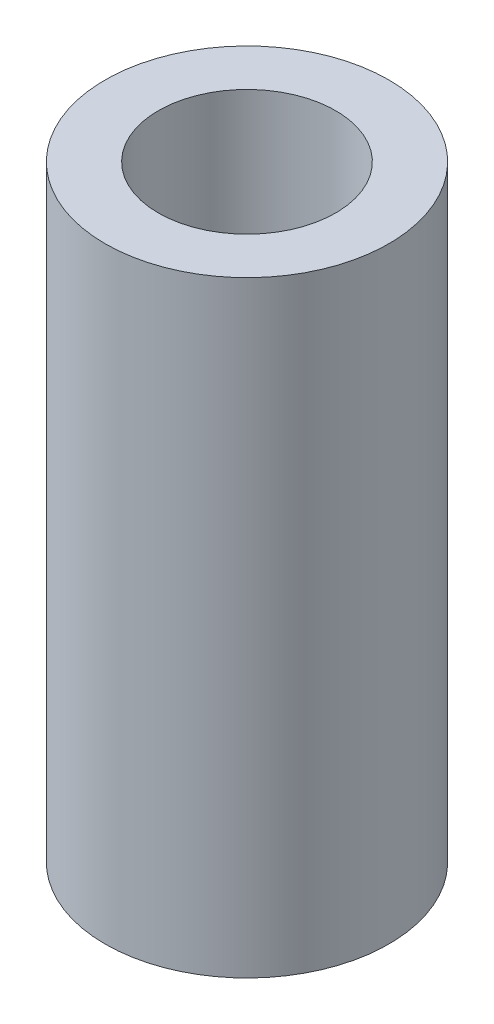
ISO-10303-21;
HEADER;
FILE_DESCRIPTION(('STEP AP214'),'2;1');
FILE_NAME('part.step','',(''),(''),'','','');
FILE_SCHEMA(('AUTOMOTIVE_DESIGN { 1 0 10303 214 1 1 1 1 }'));
ENDSEC;
DATA;
#1=APPLICATION_CONTEXT('core data for automotive mechanical design processes');
#2=APPLICATION_PROTOCOL_DEFINITION('international standard','automotive_design',2000,#1);
#3=PRODUCT_CONTEXT('',#1,'mechanical');
#4=PRODUCT('Part','Part','',(#3));
#5=PRODUCT_RELATED_PRODUCT_CATEGORY('part','',(#4));
#6=PRODUCT_DEFINITION_FORMATION('','',#4);
#7=PRODUCT_DEFINITION_CONTEXT('part definition',#1,'design');
#8=PRODUCT_DEFINITION('design','',#6,#7);
#9=PRODUCT_DEFINITION_SHAPE('','',#8);
#10=(LENGTH_UNIT() NAMED_UNIT(*) SI_UNIT(.MILLI.,.METRE.));
#11=(NAMED_UNIT(*) PLANE_ANGLE_UNIT() SI_UNIT($,.RADIAN.));
#12=(NAMED_UNIT(*) SI_UNIT($,.STERADIAN.) SOLID_ANGLE_UNIT());
#13=UNCERTAINTY_MEASURE_WITH_UNIT(LENGTH_MEASURE(1.E-05),#10,'distance_accuracy_value','');
#14=(GEOMETRIC_REPRESENTATION_CONTEXT(3) GLOBAL_UNCERTAINTY_ASSIGNED_CONTEXT((#13)) GLOBAL_UNIT_ASSIGNED_CONTEXT((#10,
#11,#12)) REPRESENTATION_CONTEXT('',''));
#15=CARTESIAN_POINT('',(0.,0.,0.));
#16=DIRECTION('',(0.,0.,1.));
#17=DIRECTION('',(1.,0.,0.));
#18=AXIS2_PLACEMENT_3D('',#15,#16,#17);
#19=CARTESIAN_POINT('',(0.,8.55,0.));
#20=DIRECTION('',(0.,1.,0.));
#21=DIRECTION('',(0.,0.,1.));
#22=AXIS2_PLACEMENT_3D('',#19,#20,#21);
#23=PLANE('',#22);
#24=CARTESIAN_POINT('',(0.,8.55,0.));
#25=DIRECTION('',(0.,1.,0.));
#26=DIRECTION('',(0.,0.,1.));
#27=AXIS2_PLACEMENT_3D('',#24,#25,#26);
#28=CIRCLE('',#27,2.);
#29=CARTESIAN_POINT('',(0.,8.55,2.));
#30=VERTEX_POINT('',#29);
#31=EDGE_CURVE('E10',#30,#30,#28,.T.);
#32=ORIENTED_EDGE('',*,*,#31,.T.);
#33=EDGE_LOOP('',(#32));
#34=FACE_BOUND('',#33,.T.);
#35=CARTESIAN_POINT('',(0.,8.55,0.));
#36=DIRECTION('',(0.,1.,0.));
#37=DIRECTION('',(0.,0.,1.));
#38=AXIS2_PLACEMENT_3D('',#35,#36,#37);
#39=CIRCLE('',#38,1.25);
#40=CARTESIAN_POINT('',(0.,8.55,1.25));
#41=VERTEX_POINT('',#40);
#42=EDGE_CURVE('E50',#41,#41,#39,.T.);
#43=ORIENTED_EDGE('',*,*,#42,.F.);
#44=EDGE_LOOP('',(#43));
#45=FACE_BOUND('',#44,.T.);
#46=ADVANCED_FACE('F37',(#34,#45),#23,.T.);
#47=CARTESIAN_POINT('',(0.,0.,0.));
#48=DIRECTION('',(0.,1.,0.));
#49=DIRECTION('',(0.,0.,1.));
#50=AXIS2_PLACEMENT_3D('',#47,#48,#49);
#51=PLANE('',#50);
#52=CARTESIAN_POINT('',(0.,0.,0.));
#53=DIRECTION('',(0.,1.,0.));
#54=DIRECTION('',(0.,0.,1.));
#55=AXIS2_PLACEMENT_3D('',#52,#53,#54);
#56=CIRCLE('',#55,2.);
#57=CARTESIAN_POINT('',(0.,0.,2.));
#58=VERTEX_POINT('',#57);
#59=EDGE_CURVE('E41',#58,#58,#56,.T.);
#60=ORIENTED_EDGE('',*,*,#59,.F.);
#61=EDGE_LOOP('',(#60));
#62=FACE_BOUND('',#61,.T.);
#63=CARTESIAN_POINT('',(0.,0.,0.));
#64=DIRECTION('',(0.,1.,0.));
#65=DIRECTION('',(0.,0.,1.));
#66=AXIS2_PLACEMENT_3D('',#63,#64,#65);
#67=CIRCLE('',#66,1.25);
#68=CARTESIAN_POINT('',(0.,0.,1.25));
#69=VERTEX_POINT('',#68);
#70=EDGE_CURVE('E52',#69,#69,#67,.T.);
#71=ORIENTED_EDGE('',*,*,#70,.T.);
#72=EDGE_LOOP('',(#71));
#73=FACE_BOUND('',#72,.T.);
#74=ADVANCED_FACE('F64',(#62,#73),#51,.F.);
#75=CARTESIAN_POINT('',(0.,8.55,0.));
#76=DIRECTION('',(0.,-1.,0.));
#77=DIRECTION('',(0.,0.,-1.));
#78=AXIS2_PLACEMENT_3D('',#75,#76,#77);
#79=CYLINDRICAL_SURFACE('',#78,2.);
#80=ORIENTED_EDGE('',*,*,#31,.F.);
#81=EDGE_LOOP('',(#80));
#82=FACE_BOUND('',#81,.T.);
#83=ORIENTED_EDGE('',*,*,#59,.T.);
#84=EDGE_LOOP('',(#83));
#85=FACE_BOUND('',#84,.T.);
#86=ADVANCED_FACE('F39',(#82,#85),#79,.T.);
#87=CARTESIAN_POINT('',(0.,8.55,0.));
#88=DIRECTION('',(0.,-1.,0.));
#89=DIRECTION('',(0.,0.,-1.));
#90=AXIS2_PLACEMENT_3D('',#87,#88,#89);
#91=CYLINDRICAL_SURFACE('',#90,1.25);
#92=ORIENTED_EDGE('',*,*,#42,.T.);
#93=EDGE_LOOP('',(#92));
#94=FACE_BOUND('',#93,.T.);
#95=ORIENTED_EDGE('',*,*,#70,.F.);
#96=EDGE_LOOP('',(#95));
#97=FACE_BOUND('',#96,.T.);
#98=ADVANCED_FACE('F60',(#94,#97),#91,.F.);
#99=CLOSED_SHELL('',(#46,#74,#86,#98));
#100=MANIFOLD_SOLID_BREP('B2',#99);
#101=ADVANCED_BREP_SHAPE_REPRESENTATION('',(#18,#100),#14);
#102=SHAPE_DEFINITION_REPRESENTATION(#9,#101);
ENDSEC;
END-ISO-10303-21;
